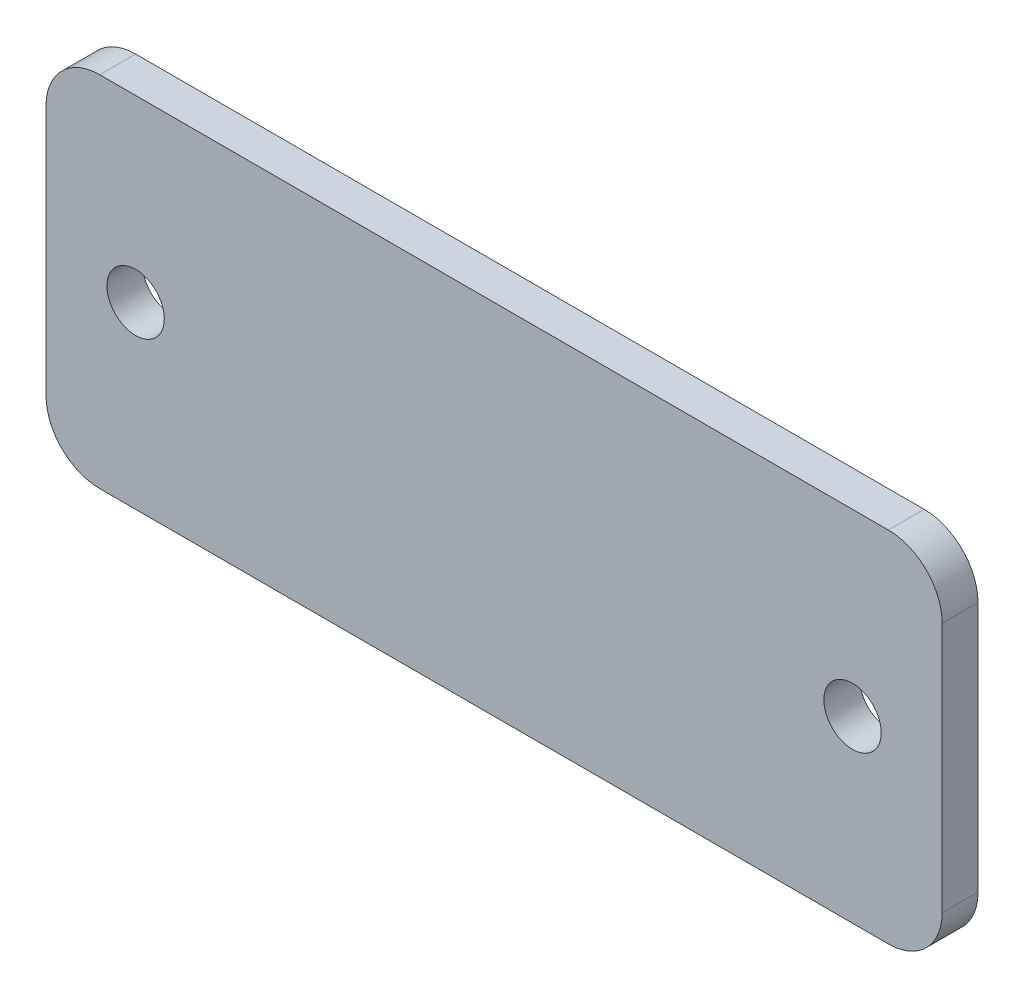
ISO-10303-21;
HEADER;
FILE_DESCRIPTION(('STEP AP214'),'2;1');
FILE_NAME('part.step','',(''),(''),'','','');
FILE_SCHEMA(('AUTOMOTIVE_DESIGN { 1 0 10303 214 1 1 1 1 }'));
ENDSEC;
DATA;
#1=APPLICATION_CONTEXT('core data for automotive mechanical design processes');
#2=APPLICATION_PROTOCOL_DEFINITION('international standard','automotive_design',2000,#1);
#3=PRODUCT_CONTEXT('',#1,'mechanical');
#4=PRODUCT('Part','Part','',(#3));
#5=PRODUCT_RELATED_PRODUCT_CATEGORY('part','',(#4));
#6=PRODUCT_DEFINITION_FORMATION('','',#4);
#7=PRODUCT_DEFINITION_CONTEXT('part definition',#1,'design');
#8=PRODUCT_DEFINITION('design','',#6,#7);
#9=PRODUCT_DEFINITION_SHAPE('','',#8);
#10=(LENGTH_UNIT() NAMED_UNIT(*) SI_UNIT(.MILLI.,.METRE.));
#11=(NAMED_UNIT(*) PLANE_ANGLE_UNIT() SI_UNIT($,.RADIAN.));
#12=(NAMED_UNIT(*) SI_UNIT($,.STERADIAN.) SOLID_ANGLE_UNIT());
#13=UNCERTAINTY_MEASURE_WITH_UNIT(LENGTH_MEASURE(1.E-05),#10,'distance_accuracy_value','');
#14=(GEOMETRIC_REPRESENTATION_CONTEXT(3) GLOBAL_UNCERTAINTY_ASSIGNED_CONTEXT((#13)) GLOBAL_UNIT_ASSIGNED_CONTEXT((#10,
#11,#12)) REPRESENTATION_CONTEXT('',''));
#15=CARTESIAN_POINT('',(0.,0.,0.));
#16=DIRECTION('',(0.,0.,1.));
#17=DIRECTION('',(1.,0.,0.));
#18=AXIS2_PLACEMENT_3D('',#15,#16,#17);
#19=CARTESIAN_POINT('',(0.,0.,0.));
#20=DIRECTION('',(0.,0.,1.));
#21=DIRECTION('',(1.,0.,0.));
#22=AXIS2_PLACEMENT_3D('',#19,#20,#21);
#23=PLANE('',#22);
#24=CARTESIAN_POINT('',(-100.,0.,0.));
#25=DIRECTION('',(0.,0.,1.));
#26=DIRECTION('',(-1.,0.,0.));
#27=AXIS2_PLACEMENT_3D('',#24,#25,#26);
#28=CIRCLE('',#27,8.);
#29=CARTESIAN_POINT('',(-92.,0.,0.));
#30=VERTEX_POINT('',#29);
#31=EDGE_CURVE('E127',#30,#30,#28,.T.);
#32=ORIENTED_EDGE('',*,*,#31,.T.);
#33=EDGE_LOOP('',(#32));
#34=FACE_BOUND('',#33,.T.);
#35=CARTESIAN_POINT('',(100.,0.,0.));
#36=DIRECTION('',(0.,0.,1.));
#37=DIRECTION('',(-1.,0.,0.));
#38=AXIS2_PLACEMENT_3D('',#35,#36,#37);
#39=CIRCLE('',#38,8.);
#40=CARTESIAN_POINT('',(108.,0.,0.));
#41=VERTEX_POINT('',#40);
#42=EDGE_CURVE('E178',#41,#41,#39,.T.);
#43=ORIENTED_EDGE('',*,*,#42,.T.);
#44=EDGE_LOOP('',(#43));
#45=FACE_BOUND('',#44,.T.);
#46=DIRECTION('',(-1.,0.,0.));
#47=VECTOR('',#46,1.);
#48=CARTESIAN_POINT('',(110.,50.,0.));
#49=LINE('',#48,#47);
#50=CARTESIAN_POINT('',(110.,50.,0.));
#51=VERTEX_POINT('',#50);
#52=CARTESIAN_POINT('',(-110.,50.,0.));
#53=VERTEX_POINT('',#52);
#54=EDGE_CURVE('E28',#51,#53,#49,.T.);
#55=ORIENTED_EDGE('',*,*,#54,.F.);
#56=CARTESIAN_POINT('',(110.,35.,0.));
#57=DIRECTION('',(0.,0.,1.));
#58=DIRECTION('',(1.,0.,0.));
#59=AXIS2_PLACEMENT_3D('',#56,#57,#58);
#60=CIRCLE('',#59,15.);
#61=CARTESIAN_POINT('',(125.,35.,0.));
#62=VERTEX_POINT('',#61);
#63=EDGE_CURVE('E162',#62,#51,#60,.T.);
#64=ORIENTED_EDGE('',*,*,#63,.F.);
#65=DIRECTION('',(0.,1.,0.));
#66=VECTOR('',#65,1.);
#67=CARTESIAN_POINT('',(125.,-35.,0.));
#68=LINE('',#67,#66);
#69=CARTESIAN_POINT('',(125.,-35.,0.));
#70=VERTEX_POINT('',#69);
#71=EDGE_CURVE('E148',#70,#62,#68,.T.);
#72=ORIENTED_EDGE('',*,*,#71,.F.);
#73=CARTESIAN_POINT('',(110.,-35.,0.));
#74=DIRECTION('',(0.,0.,1.));
#75=DIRECTION('',(0.,-1.,0.));
#76=AXIS2_PLACEMENT_3D('',#73,#74,#75);
#77=CIRCLE('',#76,15.);
#78=CARTESIAN_POINT('',(110.,-50.,0.));
#79=VERTEX_POINT('',#78);
#80=EDGE_CURVE('E209',#79,#70,#77,.T.);
#81=ORIENTED_EDGE('',*,*,#80,.F.);
#82=DIRECTION('',(1.,0.,0.));
#83=VECTOR('',#82,1.);
#84=CARTESIAN_POINT('',(-110.,-50.,0.));
#85=LINE('',#84,#83);
#86=CARTESIAN_POINT('',(-110.,-50.,0.));
#87=VERTEX_POINT('',#86);
#88=EDGE_CURVE('E153',#87,#79,#85,.T.);
#89=ORIENTED_EDGE('',*,*,#88,.F.);
#90=CARTESIAN_POINT('',(-110.,-35.,0.));
#91=DIRECTION('',(0.,0.,1.));
#92=DIRECTION('',(-1.,0.,0.));
#93=AXIS2_PLACEMENT_3D('',#90,#91,#92);
#94=CIRCLE('',#93,15.);
#95=CARTESIAN_POINT('',(-125.,-35.,0.));
#96=VERTEX_POINT('',#95);
#97=EDGE_CURVE('E91',#96,#87,#94,.T.);
#98=ORIENTED_EDGE('',*,*,#97,.F.);
#99=DIRECTION('',(0.,-1.,0.));
#100=VECTOR('',#99,1.);
#101=CARTESIAN_POINT('',(-125.,35.,0.));
#102=LINE('',#101,#100);
#103=CARTESIAN_POINT('',(-125.,35.,0.));
#104=VERTEX_POINT('',#103);
#105=EDGE_CURVE('E170',#104,#96,#102,.T.);
#106=ORIENTED_EDGE('',*,*,#105,.F.);
#107=CARTESIAN_POINT('',(-110.,35.,0.));
#108=DIRECTION('',(0.,0.,1.));
#109=DIRECTION('',(0.,1.,0.));
#110=AXIS2_PLACEMENT_3D('',#107,#108,#109);
#111=CIRCLE('',#110,15.);
#112=EDGE_CURVE('E189',#53,#104,#111,.T.);
#113=ORIENTED_EDGE('',*,*,#112,.F.);
#114=EDGE_LOOP('',(#55,#64,#72,#81,#89,#98,#106,#113));
#115=FACE_BOUND('',#114,.T.);
#116=ADVANCED_FACE('F17',(#34,#45,#115),#23,.F.);
#117=CARTESIAN_POINT('',(0.,0.,10.));
#118=DIRECTION('',(0.,0.,1.));
#119=DIRECTION('',(1.,0.,0.));
#120=AXIS2_PLACEMENT_3D('',#117,#118,#119);
#121=PLANE('',#120);
#122=CARTESIAN_POINT('',(-100.,0.,10.));
#123=DIRECTION('',(0.,0.,-1.));
#124=DIRECTION('',(-1.,0.,0.));
#125=AXIS2_PLACEMENT_3D('',#122,#123,#124);
#126=CIRCLE('',#125,8.);
#127=CARTESIAN_POINT('',(-92.,0.,10.));
#128=VERTEX_POINT('',#127);
#129=EDGE_CURVE('E128',#128,#128,#126,.T.);
#130=ORIENTED_EDGE('',*,*,#129,.T.);
#131=EDGE_LOOP('',(#130));
#132=FACE_BOUND('',#131,.T.);
#133=CARTESIAN_POINT('',(100.,0.,10.));
#134=DIRECTION('',(0.,0.,-1.));
#135=DIRECTION('',(-1.,0.,0.));
#136=AXIS2_PLACEMENT_3D('',#133,#134,#135);
#137=CIRCLE('',#136,8.);
#138=CARTESIAN_POINT('',(108.,0.,10.));
#139=VERTEX_POINT('',#138);
#140=EDGE_CURVE('E134',#139,#139,#137,.T.);
#141=ORIENTED_EDGE('',*,*,#140,.T.);
#142=EDGE_LOOP('',(#141));
#143=FACE_BOUND('',#142,.T.);
#144=DIRECTION('',(-1.,0.,0.));
#145=VECTOR('',#144,1.);
#146=CARTESIAN_POINT('',(110.,50.,10.));
#147=LINE('',#146,#145);
#148=CARTESIAN_POINT('',(110.,50.,10.));
#149=VERTEX_POINT('',#148);
#150=CARTESIAN_POINT('',(-110.,50.,10.));
#151=VERTEX_POINT('',#150);
#152=EDGE_CURVE('E11',#149,#151,#147,.T.);
#153=ORIENTED_EDGE('',*,*,#152,.T.);
#154=CARTESIAN_POINT('',(-110.,35.,10.));
#155=DIRECTION('',(0.,0.,1.));
#156=DIRECTION('',(0.,1.,0.));
#157=AXIS2_PLACEMENT_3D('',#154,#155,#156);
#158=CIRCLE('',#157,15.);
#159=CARTESIAN_POINT('',(-125.,35.,10.));
#160=VERTEX_POINT('',#159);
#161=EDGE_CURVE('E193',#151,#160,#158,.T.);
#162=ORIENTED_EDGE('',*,*,#161,.T.);
#163=DIRECTION('',(0.,-1.,0.));
#164=VECTOR('',#163,1.);
#165=CARTESIAN_POINT('',(-125.,35.,10.));
#166=LINE('',#165,#164);
#167=CARTESIAN_POINT('',(-125.,-35.,10.));
#168=VERTEX_POINT('',#167);
#169=EDGE_CURVE('E173',#160,#168,#166,.T.);
#170=ORIENTED_EDGE('',*,*,#169,.T.);
#171=CARTESIAN_POINT('',(-110.,-35.,10.));
#172=DIRECTION('',(0.,0.,1.));
#173=DIRECTION('',(-1.,0.,0.));
#174=AXIS2_PLACEMENT_3D('',#171,#172,#173);
#175=CIRCLE('',#174,15.);
#176=CARTESIAN_POINT('',(-110.,-50.,10.));
#177=VERTEX_POINT('',#176);
#178=EDGE_CURVE('E78',#168,#177,#175,.T.);
#179=ORIENTED_EDGE('',*,*,#178,.T.);
#180=DIRECTION('',(1.,0.,0.));
#181=VECTOR('',#180,1.);
#182=CARTESIAN_POINT('',(-110.,-50.,10.));
#183=LINE('',#182,#181);
#184=CARTESIAN_POINT('',(110.,-50.,10.));
#185=VERTEX_POINT('',#184);
#186=EDGE_CURVE('E149',#177,#185,#183,.T.);
#187=ORIENTED_EDGE('',*,*,#186,.T.);
#188=CARTESIAN_POINT('',(110.,-35.,10.));
#189=DIRECTION('',(0.,0.,1.));
#190=DIRECTION('',(0.,-1.,0.));
#191=AXIS2_PLACEMENT_3D('',#188,#189,#190);
#192=CIRCLE('',#191,15.);
#193=CARTESIAN_POINT('',(125.,-35.,10.));
#194=VERTEX_POINT('',#193);
#195=EDGE_CURVE('E21',#185,#194,#192,.T.);
#196=ORIENTED_EDGE('',*,*,#195,.T.);
#197=DIRECTION('',(0.,1.,0.));
#198=VECTOR('',#197,1.);
#199=CARTESIAN_POINT('',(125.,-35.,10.));
#200=LINE('',#199,#198);
#201=CARTESIAN_POINT('',(125.,35.,10.));
#202=VERTEX_POINT('',#201);
#203=EDGE_CURVE('E144',#194,#202,#200,.T.);
#204=ORIENTED_EDGE('',*,*,#203,.T.);
#205=CARTESIAN_POINT('',(110.,35.,10.));
#206=DIRECTION('',(0.,0.,1.));
#207=DIRECTION('',(1.,0.,0.));
#208=AXIS2_PLACEMENT_3D('',#205,#206,#207);
#209=CIRCLE('',#208,15.);
#210=EDGE_CURVE('E161',#202,#149,#209,.T.);
#211=ORIENTED_EDGE('',*,*,#210,.T.);
#212=EDGE_LOOP('',(#153,#162,#170,#179,#187,#196,#204,#211));
#213=FACE_BOUND('',#212,.T.);
#214=ADVANCED_FACE('F228',(#132,#143,#213),#121,.T.);
#215=CARTESIAN_POINT('',(0.,50.,0.));
#216=DIRECTION('',(0.,1.,0.));
#217=DIRECTION('',(1.,0.,0.));
#218=AXIS2_PLACEMENT_3D('',#215,#216,#217);
#219=PLANE('',#218);
#220=ORIENTED_EDGE('',*,*,#54,.T.);
#221=DIRECTION('',(0.,0.,1.));
#222=VECTOR('',#221,1.);
#223=CARTESIAN_POINT('',(-110.,50.,0.));
#224=LINE('',#223,#222);
#225=EDGE_CURVE('E176',#53,#151,#224,.T.);
#226=ORIENTED_EDGE('',*,*,#225,.T.);
#227=ORIENTED_EDGE('',*,*,#152,.F.);
#228=DIRECTION('',(0.,0.,1.));
#229=VECTOR('',#228,1.);
#230=CARTESIAN_POINT('',(110.,50.,0.));
#231=LINE('',#230,#229);
#232=EDGE_CURVE('E157',#51,#149,#231,.T.);
#233=ORIENTED_EDGE('',*,*,#232,.F.);
#234=EDGE_LOOP('',(#220,#226,#227,#233));
#235=FACE_BOUND('',#234,.T.);
#236=ADVANCED_FACE('F237',(#235),#219,.T.);
#237=CARTESIAN_POINT('',(-110.,35.,0.));
#238=DIRECTION('',(0.,0.,1.));
#239=DIRECTION('',(0.,1.,0.));
#240=AXIS2_PLACEMENT_3D('',#237,#238,#239);
#241=CYLINDRICAL_SURFACE('',#240,15.);
#242=ORIENTED_EDGE('',*,*,#112,.T.);
#243=DIRECTION('',(0.,0.,1.));
#244=VECTOR('',#243,1.);
#245=CARTESIAN_POINT('',(-125.,35.,0.));
#246=LINE('',#245,#244);
#247=EDGE_CURVE('E185',#104,#160,#246,.T.);
#248=ORIENTED_EDGE('',*,*,#247,.T.);
#249=ORIENTED_EDGE('',*,*,#161,.F.);
#250=ORIENTED_EDGE('',*,*,#225,.F.);
#251=EDGE_LOOP('',(#242,#248,#249,#250));
#252=FACE_BOUND('',#251,.T.);
#253=ADVANCED_FACE('F261',(#252),#241,.T.);
#254=CARTESIAN_POINT('',(-125.,35.,0.));
#255=DIRECTION('',(-1.,0.,0.));
#256=DIRECTION('',(0.,0.,1.));
#257=AXIS2_PLACEMENT_3D('',#254,#255,#256);
#258=PLANE('',#257);
#259=ORIENTED_EDGE('',*,*,#105,.T.);
#260=DIRECTION('',(0.,0.,1.));
#261=VECTOR('',#260,1.);
#262=CARTESIAN_POINT('',(-125.,-35.,0.));
#263=LINE('',#262,#261);
#264=EDGE_CURVE('E174',#96,#168,#263,.T.);
#265=ORIENTED_EDGE('',*,*,#264,.T.);
#266=ORIENTED_EDGE('',*,*,#169,.F.);
#267=ORIENTED_EDGE('',*,*,#247,.F.);
#268=EDGE_LOOP('',(#259,#265,#266,#267));
#269=FACE_BOUND('',#268,.T.);
#270=ADVANCED_FACE('F264',(#269),#258,.T.);
#271=CARTESIAN_POINT('',(-110.,-35.,0.));
#272=DIRECTION('',(0.,0.,1.));
#273=DIRECTION('',(-1.,0.,0.));
#274=AXIS2_PLACEMENT_3D('',#271,#272,#273);
#275=CYLINDRICAL_SURFACE('',#274,15.);
#276=ORIENTED_EDGE('',*,*,#97,.T.);
#277=DIRECTION('',(0.,0.,1.));
#278=VECTOR('',#277,1.);
#279=CARTESIAN_POINT('',(-110.,-50.,0.));
#280=LINE('',#279,#278);
#281=EDGE_CURVE('E152',#87,#177,#280,.T.);
#282=ORIENTED_EDGE('',*,*,#281,.T.);
#283=ORIENTED_EDGE('',*,*,#178,.F.);
#284=ORIENTED_EDGE('',*,*,#264,.F.);
#285=EDGE_LOOP('',(#276,#282,#283,#284));
#286=FACE_BOUND('',#285,.T.);
#287=ADVANCED_FACE('F254',(#286),#275,.T.);
#288=CARTESIAN_POINT('',(-110.,-50.,0.));
#289=DIRECTION('',(0.,-1.,0.));
#290=DIRECTION('',(0.,0.,-1.));
#291=AXIS2_PLACEMENT_3D('',#288,#289,#290);
#292=PLANE('',#291);
#293=ORIENTED_EDGE('',*,*,#88,.T.);
#294=DIRECTION('',(0.,0.,1.));
#295=VECTOR('',#294,1.);
#296=CARTESIAN_POINT('',(110.,-50.,0.));
#297=LINE('',#296,#295);
#298=EDGE_CURVE('E167',#79,#185,#297,.T.);
#299=ORIENTED_EDGE('',*,*,#298,.T.);
#300=ORIENTED_EDGE('',*,*,#186,.F.);
#301=ORIENTED_EDGE('',*,*,#281,.F.);
#302=EDGE_LOOP('',(#293,#299,#300,#301));
#303=FACE_BOUND('',#302,.T.);
#304=ADVANCED_FACE('F253',(#303),#292,.T.);
#305=CARTESIAN_POINT('',(110.,-35.,0.));
#306=DIRECTION('',(0.,0.,1.));
#307=DIRECTION('',(0.,-1.,0.));
#308=AXIS2_PLACEMENT_3D('',#305,#306,#307);
#309=CYLINDRICAL_SURFACE('',#308,15.);
#310=ORIENTED_EDGE('',*,*,#80,.T.);
#311=DIRECTION('',(0.,0.,1.));
#312=VECTOR('',#311,1.);
#313=CARTESIAN_POINT('',(125.,-35.,0.));
#314=LINE('',#313,#312);
#315=EDGE_CURVE('E147',#70,#194,#314,.T.);
#316=ORIENTED_EDGE('',*,*,#315,.T.);
#317=ORIENTED_EDGE('',*,*,#195,.F.);
#318=ORIENTED_EDGE('',*,*,#298,.F.);
#319=EDGE_LOOP('',(#310,#316,#317,#318));
#320=FACE_BOUND('',#319,.T.);
#321=ADVANCED_FACE('F19',(#320),#309,.T.);
#322=CARTESIAN_POINT('',(125.,-35.,0.));
#323=DIRECTION('',(1.,0.,0.));
#324=DIRECTION('',(0.,1.,0.));
#325=AXIS2_PLACEMENT_3D('',#322,#323,#324);
#326=PLANE('',#325);
#327=ORIENTED_EDGE('',*,*,#71,.T.);
#328=DIRECTION('',(0.,0.,1.));
#329=VECTOR('',#328,1.);
#330=CARTESIAN_POINT('',(125.,35.,0.));
#331=LINE('',#330,#329);
#332=EDGE_CURVE('E156',#62,#202,#331,.T.);
#333=ORIENTED_EDGE('',*,*,#332,.T.);
#334=ORIENTED_EDGE('',*,*,#203,.F.);
#335=ORIENTED_EDGE('',*,*,#315,.F.);
#336=EDGE_LOOP('',(#327,#333,#334,#335));
#337=FACE_BOUND('',#336,.T.);
#338=ADVANCED_FACE('F244',(#337),#326,.T.);
#339=CARTESIAN_POINT('',(110.,35.,0.));
#340=DIRECTION('',(0.,0.,1.));
#341=DIRECTION('',(1.,0.,0.));
#342=AXIS2_PLACEMENT_3D('',#339,#340,#341);
#343=CYLINDRICAL_SURFACE('',#342,15.);
#344=ORIENTED_EDGE('',*,*,#63,.T.);
#345=ORIENTED_EDGE('',*,*,#232,.T.);
#346=ORIENTED_EDGE('',*,*,#210,.F.);
#347=ORIENTED_EDGE('',*,*,#332,.F.);
#348=EDGE_LOOP('',(#344,#345,#346,#347));
#349=FACE_BOUND('',#348,.T.);
#350=ADVANCED_FACE('F241',(#349),#343,.T.);
#351=CARTESIAN_POINT('',(-100.,0.,0.));
#352=DIRECTION('',(0.,0.,1.));
#353=DIRECTION('',(-1.,0.,0.));
#354=AXIS2_PLACEMENT_3D('',#351,#352,#353);
#355=CYLINDRICAL_SURFACE('',#354,8.);
#356=ORIENTED_EDGE('',*,*,#31,.F.);
#357=DIRECTION('',(0.,0.,1.));
#358=VECTOR('',#357,1.);
#359=CARTESIAN_POINT('',(-92.,0.,0.));
#360=LINE('',#359,#358);
#361=EDGE_CURVE('E124',#30,#128,#360,.T.);
#362=ORIENTED_EDGE('',*,*,#361,.T.);
#363=ORIENTED_EDGE('',*,*,#129,.F.);
#364=ORIENTED_EDGE('',*,*,#361,.F.);
#365=EDGE_LOOP('',(#356,#362,#363,#364));
#366=FACE_BOUND('',#365,.T.);
#367=ADVANCED_FACE('F126',(#366),#355,.F.);
#368=CARTESIAN_POINT('',(100.,0.,0.));
#369=DIRECTION('',(0.,0.,1.));
#370=DIRECTION('',(-1.,0.,0.));
#371=AXIS2_PLACEMENT_3D('',#368,#369,#370);
#372=CYLINDRICAL_SURFACE('',#371,8.);
#373=ORIENTED_EDGE('',*,*,#42,.F.);
#374=DIRECTION('',(0.,0.,1.));
#375=VECTOR('',#374,1.);
#376=CARTESIAN_POINT('',(108.,0.,0.));
#377=LINE('',#376,#375);
#378=EDGE_CURVE('E140',#41,#139,#377,.T.);
#379=ORIENTED_EDGE('',*,*,#378,.T.);
#380=ORIENTED_EDGE('',*,*,#140,.F.);
#381=ORIENTED_EDGE('',*,*,#378,.F.);
#382=EDGE_LOOP('',(#373,#379,#380,#381));
#383=FACE_BOUND('',#382,.T.);
#384=ADVANCED_FACE('F225',(#383),#372,.F.);
#385=CLOSED_SHELL('',(#116,#214,#236,#253,#270,#287,#304,#321,#338,#350,#367,#384));
#386=MANIFOLD_SOLID_BREP('B1',#385);
#387=ADVANCED_BREP_SHAPE_REPRESENTATION('',(#18,#386),#14);
#388=SHAPE_DEFINITION_REPRESENTATION(#9,#387);
ENDSEC;
END-ISO-10303-21;
